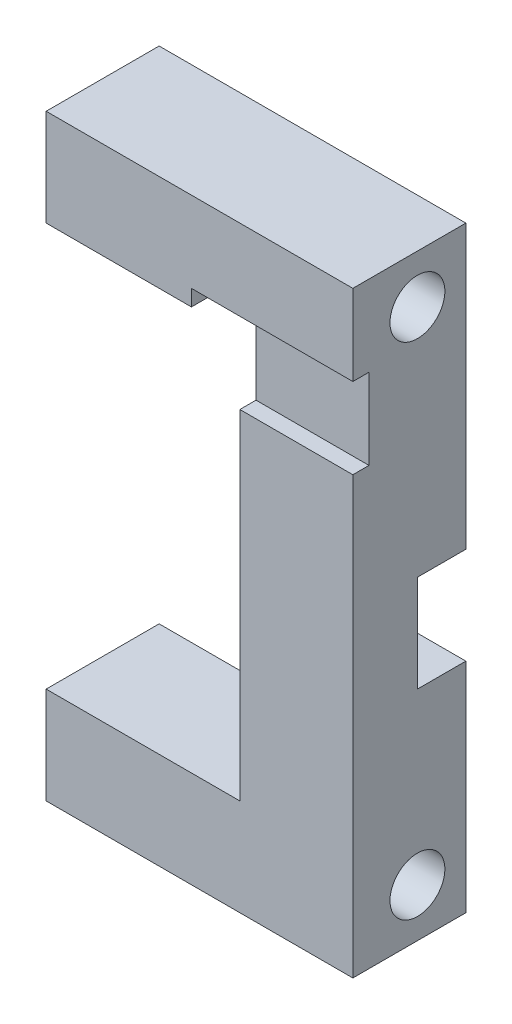
ISO-10303-21;
HEADER;
FILE_DESCRIPTION(('STEP AP214'),'2;1');
FILE_NAME('part.step','',(''),(''),'','','');
FILE_SCHEMA(('AUTOMOTIVE_DESIGN { 1 0 10303 214 1 1 1 1 }'));
ENDSEC;
DATA;
#1=APPLICATION_CONTEXT('core data for automotive mechanical design processes');
#2=APPLICATION_PROTOCOL_DEFINITION('international standard','automotive_design',2000,#1);
#3=PRODUCT_CONTEXT('',#1,'mechanical');
#4=PRODUCT('Part','Part','',(#3));
#5=PRODUCT_RELATED_PRODUCT_CATEGORY('part','',(#4));
#6=PRODUCT_DEFINITION_FORMATION('','',#4);
#7=PRODUCT_DEFINITION_CONTEXT('part definition',#1,'design');
#8=PRODUCT_DEFINITION('design','',#6,#7);
#9=PRODUCT_DEFINITION_SHAPE('','',#8);
#10=(LENGTH_UNIT() NAMED_UNIT(*) SI_UNIT(.MILLI.,.METRE.));
#11=(NAMED_UNIT(*) PLANE_ANGLE_UNIT() SI_UNIT($,.RADIAN.));
#12=(NAMED_UNIT(*) SI_UNIT($,.STERADIAN.) SOLID_ANGLE_UNIT());
#13=UNCERTAINTY_MEASURE_WITH_UNIT(LENGTH_MEASURE(1.E-05),#10,'distance_accuracy_value','');
#14=(GEOMETRIC_REPRESENTATION_CONTEXT(3) GLOBAL_UNCERTAINTY_ASSIGNED_CONTEXT((#13)) GLOBAL_UNIT_ASSIGNED_CONTEXT((#10,
#11,#12)) REPRESENTATION_CONTEXT('',''));
#15=CARTESIAN_POINT('',(0.,0.,0.));
#16=DIRECTION('',(0.,0.,1.));
#17=DIRECTION('',(1.,0.,0.));
#18=AXIS2_PLACEMENT_3D('',#15,#16,#17);
#19=CARTESIAN_POINT('',(0.,0.,7.));
#20=DIRECTION('',(0.,0.,-1.));
#21=DIRECTION('',(-1.,0.,0.));
#22=AXIS2_PLACEMENT_3D('',#19,#20,#21);
#23=PLANE('',#22);
#24=DIRECTION('',(1.,0.,0.));
#25=VECTOR('',#24,1.);
#26=CARTESIAN_POINT('',(12.,31.,7.));
#27=LINE('',#26,#25);
#28=CARTESIAN_POINT('',(0.,31.,7.));
#29=VERTEX_POINT('',#28);
#30=CARTESIAN_POINT('',(9.00000000000001,31.,7.));
#31=VERTEX_POINT('',#30);
#32=EDGE_CURVE('E274',#29,#31,#27,.T.);
#33=ORIENTED_EDGE('',*,*,#32,.T.);
#34=DIRECTION('',(0.,-1.,0.));
#35=VECTOR('',#34,1.);
#36=CARTESIAN_POINT('',(9.00000000000001,32.,7.));
#37=LINE('',#36,#35);
#38=CARTESIAN_POINT('',(9.00000000000001,32.,7.));
#39=VERTEX_POINT('',#38);
#40=EDGE_CURVE('E187',#39,#31,#37,.T.);
#41=ORIENTED_EDGE('',*,*,#40,.F.);
#42=DIRECTION('',(-1.,0.,0.));
#43=VECTOR('',#42,1.);
#44=CARTESIAN_POINT('',(9.00000000000001,32.,7.));
#45=LINE('',#44,#43);
#46=CARTESIAN_POINT('',(19.,32.,7.));
#47=VERTEX_POINT('',#46);
#48=EDGE_CURVE('E190',#47,#39,#45,.T.);
#49=ORIENTED_EDGE('',*,*,#48,.F.);
#50=DIRECTION('',(0.,1.,0.));
#51=VECTOR('',#50,1.);
#52=CARTESIAN_POINT('',(19.,37.,7.));
#53=LINE('',#52,#51);
#54=CARTESIAN_POINT('',(19.,37.,7.));
#55=VERTEX_POINT('',#54);
#56=EDGE_CURVE('E263',#47,#55,#53,.T.);
#57=ORIENTED_EDGE('',*,*,#56,.T.);
#58=DIRECTION('',(-1.,0.,0.));
#59=VECTOR('',#58,1.);
#60=CARTESIAN_POINT('',(0.,37.,7.));
#61=LINE('',#60,#59);
#62=CARTESIAN_POINT('',(0.,37.,7.));
#63=VERTEX_POINT('',#62);
#64=EDGE_CURVE('E268',#55,#63,#61,.T.);
#65=ORIENTED_EDGE('',*,*,#64,.T.);
#66=DIRECTION('',(0.,-1.,0.));
#67=VECTOR('',#66,1.);
#68=CARTESIAN_POINT('',(0.,31.,7.));
#69=LINE('',#68,#67);
#70=EDGE_CURVE('E271',#63,#29,#69,.T.);
#71=ORIENTED_EDGE('',*,*,#70,.T.);
#72=EDGE_LOOP('',(#33,#41,#49,#57,#65,#71));
#73=FACE_BOUND('',#72,.T.);
#74=ADVANCED_FACE('F39',(#73),#23,.F.);
#75=CARTESIAN_POINT('',(0.,0.,0.));
#76=DIRECTION('',(0.,0.,-1.));
#77=DIRECTION('',(-1.,0.,0.));
#78=AXIS2_PLACEMENT_3D('',#75,#76,#77);
#79=PLANE('',#78);
#80=DIRECTION('',(1.,0.,0.));
#81=VECTOR('',#80,1.);
#82=CARTESIAN_POINT('',(19.,19.5,0.));
#83=LINE('',#82,#81);
#84=CARTESIAN_POINT('',(12.,19.5,0.));
#85=VERTEX_POINT('',#84);
#86=CARTESIAN_POINT('',(19.,19.5,0.));
#87=VERTEX_POINT('',#86);
#88=EDGE_CURVE('E230',#85,#87,#83,.T.);
#89=ORIENTED_EDGE('',*,*,#88,.F.);
#90=DIRECTION('',(0.,-1.,0.));
#91=VECTOR('',#90,1.);
#92=CARTESIAN_POINT('',(12.,6.,0.));
#93=LINE('',#92,#91);
#94=CARTESIAN_POINT('',(12.,31.,0.));
#95=VERTEX_POINT('',#94);
#96=EDGE_CURVE('E307',#95,#85,#93,.T.);
#97=ORIENTED_EDGE('',*,*,#96,.F.);
#98=DIRECTION('',(1.,0.,0.));
#99=VECTOR('',#98,1.);
#100=CARTESIAN_POINT('',(12.,31.,0.));
#101=LINE('',#100,#99);
#102=CARTESIAN_POINT('',(0.,31.,0.));
#103=VERTEX_POINT('',#102);
#104=EDGE_CURVE('E302',#103,#95,#101,.T.);
#105=ORIENTED_EDGE('',*,*,#104,.F.);
#106=DIRECTION('',(0.,-1.,0.));
#107=VECTOR('',#106,1.);
#108=CARTESIAN_POINT('',(0.,31.,0.));
#109=LINE('',#108,#107);
#110=CARTESIAN_POINT('',(0.,37.,0.));
#111=VERTEX_POINT('',#110);
#112=EDGE_CURVE('E299',#111,#103,#109,.T.);
#113=ORIENTED_EDGE('',*,*,#112,.F.);
#114=DIRECTION('',(-1.,0.,0.));
#115=VECTOR('',#114,1.);
#116=CARTESIAN_POINT('',(0.,37.,0.));
#117=LINE('',#116,#115);
#118=CARTESIAN_POINT('',(19.,37.,0.));
#119=VERTEX_POINT('',#118);
#120=EDGE_CURVE('E296',#119,#111,#117,.T.);
#121=ORIENTED_EDGE('',*,*,#120,.F.);
#122=DIRECTION('',(0.,1.,0.));
#123=VECTOR('',#122,1.);
#124=CARTESIAN_POINT('',(19.,37.,0.));
#125=LINE('',#124,#123);
#126=EDGE_CURVE('E291',#87,#119,#125,.T.);
#127=ORIENTED_EDGE('',*,*,#126,.F.);
#128=EDGE_LOOP('',(#89,#97,#105,#113,#121,#127));
#129=FACE_BOUND('',#128,.T.);
#130=ADVANCED_FACE('F383',(#129),#79,.T.);
#131=CARTESIAN_POINT('',(19.,0.,7.));
#132=DIRECTION('',(0.,1.,0.));
#133=DIRECTION('',(-1.,0.,0.));
#134=AXIS2_PLACEMENT_3D('',#131,#132,#133);
#135=PLANE('',#134);
#136=DIRECTION('',(1.,0.,0.));
#137=VECTOR('',#136,1.);
#138=CARTESIAN_POINT('',(19.,0.,0.));
#139=LINE('',#138,#137);
#140=CARTESIAN_POINT('',(0.,0.,0.));
#141=VERTEX_POINT('',#140);
#142=CARTESIAN_POINT('',(19.,0.,0.));
#143=VERTEX_POINT('',#142);
#144=EDGE_CURVE('E249',#141,#143,#139,.T.);
#145=ORIENTED_EDGE('',*,*,#144,.T.);
#146=DIRECTION('',(0.,0.,-1.));
#147=VECTOR('',#146,1.);
#148=CARTESIAN_POINT('',(19.,0.,7.));
#149=LINE('',#148,#147);
#150=CARTESIAN_POINT('',(19.,0.,7.));
#151=VERTEX_POINT('',#150);
#152=EDGE_CURVE('E342',#151,#143,#149,.T.);
#153=ORIENTED_EDGE('',*,*,#152,.F.);
#154=DIRECTION('',(1.,0.,0.));
#155=VECTOR('',#154,1.);
#156=CARTESIAN_POINT('',(19.,0.,7.));
#157=LINE('',#156,#155);
#158=CARTESIAN_POINT('',(0.,0.,7.));
#159=VERTEX_POINT('',#158);
#160=EDGE_CURVE('E259',#159,#151,#157,.T.);
#161=ORIENTED_EDGE('',*,*,#160,.F.);
#162=DIRECTION('',(0.,0.,-1.));
#163=VECTOR('',#162,1.);
#164=CARTESIAN_POINT('',(0.,0.,7.));
#165=LINE('',#164,#163);
#166=EDGE_CURVE('E287',#159,#141,#165,.T.);
#167=ORIENTED_EDGE('',*,*,#166,.T.);
#168=EDGE_LOOP('',(#145,#153,#161,#167));
#169=FACE_BOUND('',#168,.T.);
#170=ADVANCED_FACE('F41',(#169),#135,.F.);
#171=CARTESIAN_POINT('',(19.,37.,7.));
#172=DIRECTION('',(-1.,0.,0.));
#173=DIRECTION('',(0.,-1.,0.));
#174=AXIS2_PLACEMENT_3D('',#171,#172,#173);
#175=PLANE('',#174);
#176=ORIENTED_EDGE('',*,*,#56,.F.);
#177=DIRECTION('',(0.,0.,1.));
#178=VECTOR('',#177,1.);
#179=CARTESIAN_POINT('',(19.,32.,6.));
#180=LINE('',#179,#178);
#181=CARTESIAN_POINT('',(19.,32.,6.));
#182=VERTEX_POINT('',#181);
#183=EDGE_CURVE('E174',#182,#47,#180,.T.);
#184=ORIENTED_EDGE('',*,*,#183,.F.);
#185=DIRECTION('',(0.,1.,0.));
#186=VECTOR('',#185,1.);
#187=CARTESIAN_POINT('',(19.,32.,6.));
#188=LINE('',#187,#186);
#189=CARTESIAN_POINT('',(19.,27.,6.));
#190=VERTEX_POINT('',#189);
#191=EDGE_CURVE('E162',#190,#182,#188,.T.);
#192=ORIENTED_EDGE('',*,*,#191,.F.);
#193=DIRECTION('',(0.,0.,1.));
#194=VECTOR('',#193,1.);
#195=CARTESIAN_POINT('',(19.,27.,6.));
#196=LINE('',#195,#194);
#197=CARTESIAN_POINT('',(19.,27.,7.));
#198=VERTEX_POINT('',#197);
#199=EDGE_CURVE('E169',#190,#198,#196,.T.);
#200=ORIENTED_EDGE('',*,*,#199,.T.);
#201=EDGE_CURVE('E265',#151,#198,#53,.T.);
#202=ORIENTED_EDGE('',*,*,#201,.F.);
#203=ORIENTED_EDGE('',*,*,#152,.T.);
#204=CARTESIAN_POINT('',(19.,13.5,0.));
#205=VERTEX_POINT('',#204);
#206=EDGE_CURVE('E292',#143,#205,#125,.T.);
#207=ORIENTED_EDGE('',*,*,#206,.T.);
#208=DIRECTION('',(0.,0.,-1.));
#209=VECTOR('',#208,1.);
#210=CARTESIAN_POINT('',(19.,13.5,3.));
#211=LINE('',#210,#209);
#212=CARTESIAN_POINT('',(19.,13.5,3.));
#213=VERTEX_POINT('',#212);
#214=EDGE_CURVE('E63',#213,#205,#211,.T.);
#215=ORIENTED_EDGE('',*,*,#214,.F.);
#216=DIRECTION('',(0.,-1.,0.));
#217=VECTOR('',#216,1.);
#218=CARTESIAN_POINT('',(19.,19.5,3.));
#219=LINE('',#218,#217);
#220=CARTESIAN_POINT('',(19.,19.5,3.));
#221=VERTEX_POINT('',#220);
#222=EDGE_CURVE('E225',#221,#213,#219,.T.);
#223=ORIENTED_EDGE('',*,*,#222,.F.);
#224=DIRECTION('',(0.,0.,-1.));
#225=VECTOR('',#224,1.);
#226=CARTESIAN_POINT('',(19.,19.5,3.));
#227=LINE('',#226,#225);
#228=EDGE_CURVE('E245',#221,#87,#227,.T.);
#229=ORIENTED_EDGE('',*,*,#228,.T.);
#230=ORIENTED_EDGE('',*,*,#126,.T.);
#231=DIRECTION('',(0.,0.,-1.));
#232=VECTOR('',#231,1.);
#233=CARTESIAN_POINT('',(19.,37.,7.));
#234=LINE('',#233,#232);
#235=EDGE_CURVE('E338',#55,#119,#234,.T.);
#236=ORIENTED_EDGE('',*,*,#235,.F.);
#237=EDGE_LOOP('',(#176,#184,#192,#200,#202,#203,#207,#215,#223,#229,#230,#236));
#238=FACE_BOUND('',#237,.T.);
#239=CARTESIAN_POINT('',(19.,34.,3.));
#240=DIRECTION('',(-1.,0.,0.));
#241=DIRECTION('',(0.,0.,1.));
#242=AXIS2_PLACEMENT_3D('',#239,#240,#241);
#243=CIRCLE('',#242,1.7);
#244=CARTESIAN_POINT('',(19.,34.,4.7));
#245=VERTEX_POINT('',#244);
#246=EDGE_CURVE('E209',#245,#245,#243,.T.);
#247=ORIENTED_EDGE('',*,*,#246,.T.);
#248=EDGE_LOOP('',(#247));
#249=FACE_BOUND('',#248,.T.);
#250=CARTESIAN_POINT('',(19.,3.,3.));
#251=DIRECTION('',(-1.,0.,0.));
#252=DIRECTION('',(0.,0.,1.));
#253=AXIS2_PLACEMENT_3D('',#250,#251,#252);
#254=CIRCLE('',#253,1.7);
#255=CARTESIAN_POINT('',(19.,3.,4.7));
#256=VERTEX_POINT('',#255);
#257=EDGE_CURVE('E218',#256,#256,#254,.T.);
#258=ORIENTED_EDGE('',*,*,#257,.T.);
#259=EDGE_LOOP('',(#258));
#260=FACE_BOUND('',#259,.T.);
#261=ADVANCED_FACE('F179',(#238,#249,#260),#175,.F.);
#262=CARTESIAN_POINT('',(0.,37.,7.));
#263=DIRECTION('',(0.,-1.,0.));
#264=DIRECTION('',(0.,0.,-1.));
#265=AXIS2_PLACEMENT_3D('',#262,#263,#264);
#266=PLANE('',#265);
#267=ORIENTED_EDGE('',*,*,#120,.T.);
#268=DIRECTION('',(0.,0.,-1.));
#269=VECTOR('',#268,1.);
#270=CARTESIAN_POINT('',(0.,37.,7.));
#271=LINE('',#270,#269);
#272=EDGE_CURVE('E334',#63,#111,#271,.T.);
#273=ORIENTED_EDGE('',*,*,#272,.F.);
#274=ORIENTED_EDGE('',*,*,#64,.F.);
#275=ORIENTED_EDGE('',*,*,#235,.T.);
#276=EDGE_LOOP('',(#267,#273,#274,#275));
#277=FACE_BOUND('',#276,.T.);
#278=ADVANCED_FACE('F395',(#277),#266,.F.);
#279=CARTESIAN_POINT('',(0.,31.,7.));
#280=DIRECTION('',(1.,0.,0.));
#281=DIRECTION('',(0.,0.,-1.));
#282=AXIS2_PLACEMENT_3D('',#279,#280,#281);
#283=PLANE('',#282);
#284=CARTESIAN_POINT('',(0.,34.,3.));
#285=DIRECTION('',(-1.,0.,0.));
#286=DIRECTION('',(0.,0.,1.));
#287=AXIS2_PLACEMENT_3D('',#284,#285,#286);
#288=CIRCLE('',#287,1.7);
#289=CARTESIAN_POINT('',(0.,34.,4.7));
#290=VERTEX_POINT('',#289);
#291=EDGE_CURVE('E214',#290,#290,#288,.T.);
#292=ORIENTED_EDGE('',*,*,#291,.F.);
#293=EDGE_LOOP('',(#292));
#294=FACE_BOUND('',#293,.T.);
#295=ORIENTED_EDGE('',*,*,#112,.T.);
#296=DIRECTION('',(0.,0.,-1.));
#297=VECTOR('',#296,1.);
#298=CARTESIAN_POINT('',(0.,31.,7.));
#299=LINE('',#298,#297);
#300=EDGE_CURVE('E330',#29,#103,#299,.T.);
#301=ORIENTED_EDGE('',*,*,#300,.F.);
#302=ORIENTED_EDGE('',*,*,#70,.F.);
#303=ORIENTED_EDGE('',*,*,#272,.T.);
#304=EDGE_LOOP('',(#295,#301,#302,#303));
#305=FACE_BOUND('',#304,.T.);
#306=ADVANCED_FACE('F399',(#294,#305),#283,.F.);
#307=CARTESIAN_POINT('',(12.,31.,7.));
#308=DIRECTION('',(0.,1.,0.));
#309=DIRECTION('',(0.,0.,1.));
#310=AXIS2_PLACEMENT_3D('',#307,#308,#309);
#311=PLANE('',#310);
#312=DIRECTION('',(1.,0.,0.));
#313=VECTOR('',#312,1.);
#314=CARTESIAN_POINT('',(12.,31.,6.));
#315=LINE('',#314,#313);
#316=CARTESIAN_POINT('',(9.00000000000001,31.,6.));
#317=VERTEX_POINT('',#316);
#318=CARTESIAN_POINT('',(12.,31.,6.));
#319=VERTEX_POINT('',#318);
#320=EDGE_CURVE('E205',#317,#319,#315,.T.);
#321=ORIENTED_EDGE('',*,*,#320,.F.);
#322=DIRECTION('',(0.,0.,1.));
#323=VECTOR('',#322,1.);
#324=CARTESIAN_POINT('',(9.00000000000001,31.,7.));
#325=LINE('',#324,#323);
#326=EDGE_CURVE('E201',#317,#31,#325,.T.);
#327=ORIENTED_EDGE('',*,*,#326,.T.);
#328=ORIENTED_EDGE('',*,*,#32,.F.);
#329=ORIENTED_EDGE('',*,*,#300,.T.);
#330=ORIENTED_EDGE('',*,*,#104,.T.);
#331=DIRECTION('',(0.,0.,-1.));
#332=VECTOR('',#331,1.);
#333=CARTESIAN_POINT('',(12.,31.,7.));
#334=LINE('',#333,#332);
#335=EDGE_CURVE('E327',#319,#95,#334,.T.);
#336=ORIENTED_EDGE('',*,*,#335,.F.);
#337=EDGE_LOOP('',(#321,#327,#328,#329,#330,#336));
#338=FACE_BOUND('',#337,.T.);
#339=ADVANCED_FACE('F403',(#338),#311,.F.);
#340=CARTESIAN_POINT('',(12.,6.,7.));
#341=DIRECTION('',(1.,0.,0.));
#342=DIRECTION('',(0.,1.,0.));
#343=AXIS2_PLACEMENT_3D('',#340,#341,#342);
#344=PLANE('',#343);
#345=DIRECTION('',(0.,-1.,0.));
#346=VECTOR('',#345,1.);
#347=CARTESIAN_POINT('',(12.,31.,7.));
#348=LINE('',#347,#346);
#349=CARTESIAN_POINT('',(12.,27.,7.));
#350=VERTEX_POINT('',#349);
#351=CARTESIAN_POINT('',(12.,6.,7.));
#352=VERTEX_POINT('',#351);
#353=EDGE_CURVE('E278',#350,#352,#348,.T.);
#354=ORIENTED_EDGE('',*,*,#353,.F.);
#355=DIRECTION('',(0.,0.,-1.));
#356=VECTOR('',#355,1.);
#357=CARTESIAN_POINT('',(12.,27.,7.));
#358=LINE('',#357,#356);
#359=CARTESIAN_POINT('',(12.,27.,6.));
#360=VERTEX_POINT('',#359);
#361=EDGE_CURVE('E55',#350,#360,#358,.T.);
#362=ORIENTED_EDGE('',*,*,#361,.T.);
#363=DIRECTION('',(0.,-1.,0.));
#364=VECTOR('',#363,1.);
#365=CARTESIAN_POINT('',(12.,6.,6.));
#366=LINE('',#365,#364);
#367=EDGE_CURVE('E11',#319,#360,#366,.T.);
#368=ORIENTED_EDGE('',*,*,#367,.F.);
#369=ORIENTED_EDGE('',*,*,#335,.T.);
#370=ORIENTED_EDGE('',*,*,#96,.T.);
#371=DIRECTION('',(0.,0.,-1.));
#372=VECTOR('',#371,1.);
#373=CARTESIAN_POINT('',(12.,19.5,3.));
#374=LINE('',#373,#372);
#375=CARTESIAN_POINT('',(12.,19.5,3.));
#376=VERTEX_POINT('',#375);
#377=EDGE_CURVE('E250',#376,#85,#374,.T.);
#378=ORIENTED_EDGE('',*,*,#377,.F.);
#379=DIRECTION('',(0.,1.,0.));
#380=VECTOR('',#379,1.);
#381=CARTESIAN_POINT('',(12.,19.5,3.));
#382=LINE('',#381,#380);
#383=CARTESIAN_POINT('',(12.,13.5,3.));
#384=VERTEX_POINT('',#383);
#385=EDGE_CURVE('E234',#384,#376,#382,.T.);
#386=ORIENTED_EDGE('',*,*,#385,.F.);
#387=DIRECTION('',(0.,0.,-1.));
#388=VECTOR('',#387,1.);
#389=CARTESIAN_POINT('',(12.,13.5,3.));
#390=LINE('',#389,#388);
#391=CARTESIAN_POINT('',(12.,13.5,0.));
#392=VERTEX_POINT('',#391);
#393=EDGE_CURVE('E253',#384,#392,#390,.T.);
#394=ORIENTED_EDGE('',*,*,#393,.T.);
#395=CARTESIAN_POINT('',(12.,6.,0.));
#396=VERTEX_POINT('',#395);
#397=EDGE_CURVE('E306',#392,#396,#93,.T.);
#398=ORIENTED_EDGE('',*,*,#397,.T.);
#399=DIRECTION('',(0.,0.,-1.));
#400=VECTOR('',#399,1.);
#401=CARTESIAN_POINT('',(12.,6.,7.));
#402=LINE('',#401,#400);
#403=EDGE_CURVE('E323',#352,#396,#402,.T.);
#404=ORIENTED_EDGE('',*,*,#403,.F.);
#405=EDGE_LOOP('',(#354,#362,#368,#369,#370,#378,#386,#394,#398,#404));
#406=FACE_BOUND('',#405,.T.);
#407=ADVANCED_FACE('F351',(#406),#344,.F.);
#408=CARTESIAN_POINT('',(0.,6.,7.));
#409=DIRECTION('',(0.,-1.,0.));
#410=DIRECTION('',(1.,0.,0.));
#411=AXIS2_PLACEMENT_3D('',#408,#409,#410);
#412=PLANE('',#411);
#413=DIRECTION('',(-1.,0.,0.));
#414=VECTOR('',#413,1.);
#415=CARTESIAN_POINT('',(0.,6.,0.));
#416=LINE('',#415,#414);
#417=CARTESIAN_POINT('',(0.,6.,0.));
#418=VERTEX_POINT('',#417);
#419=EDGE_CURVE('E311',#396,#418,#416,.T.);
#420=ORIENTED_EDGE('',*,*,#419,.T.);
#421=DIRECTION('',(0.,0.,-1.));
#422=VECTOR('',#421,1.);
#423=CARTESIAN_POINT('',(0.,6.,7.));
#424=LINE('',#423,#422);
#425=CARTESIAN_POINT('',(0.,6.,7.));
#426=VERTEX_POINT('',#425);
#427=EDGE_CURVE('E319',#426,#418,#424,.T.);
#428=ORIENTED_EDGE('',*,*,#427,.F.);
#429=DIRECTION('',(-1.,0.,0.));
#430=VECTOR('',#429,1.);
#431=CARTESIAN_POINT('',(0.,6.,7.));
#432=LINE('',#431,#430);
#433=EDGE_CURVE('E281',#352,#426,#432,.T.);
#434=ORIENTED_EDGE('',*,*,#433,.F.);
#435=ORIENTED_EDGE('',*,*,#403,.T.);
#436=EDGE_LOOP('',(#420,#428,#434,#435));
#437=FACE_BOUND('',#436,.T.);
#438=ADVANCED_FACE('F357',(#437),#412,.F.);
#439=CARTESIAN_POINT('',(0.,0.,7.));
#440=DIRECTION('',(1.,0.,0.));
#441=DIRECTION('',(0.,0.,-1.));
#442=AXIS2_PLACEMENT_3D('',#439,#440,#441);
#443=PLANE('',#442);
#444=CARTESIAN_POINT('',(0.,3.,3.));
#445=DIRECTION('',(-1.,0.,0.));
#446=DIRECTION('',(0.,0.,1.));
#447=AXIS2_PLACEMENT_3D('',#444,#445,#446);
#448=CIRCLE('',#447,1.7);
#449=CARTESIAN_POINT('',(0.,3.,4.7));
#450=VERTEX_POINT('',#449);
#451=EDGE_CURVE('E208',#450,#450,#448,.T.);
#452=ORIENTED_EDGE('',*,*,#451,.F.);
#453=EDGE_LOOP('',(#452));
#454=FACE_BOUND('',#453,.T.);
#455=DIRECTION('',(0.,-1.,0.));
#456=VECTOR('',#455,1.);
#457=CARTESIAN_POINT('',(0.,0.,0.));
#458=LINE('',#457,#456);
#459=EDGE_CURVE('E264',#418,#141,#458,.T.);
#460=ORIENTED_EDGE('',*,*,#459,.T.);
#461=ORIENTED_EDGE('',*,*,#166,.F.);
#462=DIRECTION('',(0.,-1.,0.));
#463=VECTOR('',#462,1.);
#464=CARTESIAN_POINT('',(0.,0.,7.));
#465=LINE('',#464,#463);
#466=EDGE_CURVE('E284',#426,#159,#465,.T.);
#467=ORIENTED_EDGE('',*,*,#466,.F.);
#468=ORIENTED_EDGE('',*,*,#427,.T.);
#469=EDGE_LOOP('',(#460,#461,#467,#468));
#470=FACE_BOUND('',#469,.T.);
#471=ADVANCED_FACE('F363',(#454,#470),#443,.F.);
#472=ORIENTED_EDGE('',*,*,#201,.T.);
#473=DIRECTION('',(-1.,0.,0.));
#474=VECTOR('',#473,1.);
#475=CARTESIAN_POINT('',(0.,27.,7.));
#476=LINE('',#475,#474);
#477=EDGE_CURVE('E48',#198,#350,#476,.T.);
#478=ORIENTED_EDGE('',*,*,#477,.T.);
#479=ORIENTED_EDGE('',*,*,#353,.T.);
#480=ORIENTED_EDGE('',*,*,#433,.T.);
#481=ORIENTED_EDGE('',*,*,#466,.T.);
#482=ORIENTED_EDGE('',*,*,#160,.T.);
#483=EDGE_LOOP('',(#472,#478,#479,#480,#481,#482));
#484=FACE_BOUND('',#483,.T.);
#485=ADVANCED_FACE('F348',(#484),#23,.F.);
#486=DIRECTION('',(-1.,0.,0.));
#487=VECTOR('',#486,1.);
#488=CARTESIAN_POINT('',(19.,13.5,0.));
#489=LINE('',#488,#487);
#490=EDGE_CURVE('E213',#205,#392,#489,.T.);
#491=ORIENTED_EDGE('',*,*,#490,.F.);
#492=ORIENTED_EDGE('',*,*,#206,.F.);
#493=ORIENTED_EDGE('',*,*,#144,.F.);
#494=ORIENTED_EDGE('',*,*,#459,.F.);
#495=ORIENTED_EDGE('',*,*,#419,.F.);
#496=ORIENTED_EDGE('',*,*,#397,.F.);
#497=EDGE_LOOP('',(#491,#492,#493,#494,#495,#496));
#498=FACE_BOUND('',#497,.T.);
#499=ADVANCED_FACE('F369',(#498),#79,.T.);
#500=CARTESIAN_POINT('',(19.,19.5,3.));
#501=DIRECTION('',(0.,1.,0.));
#502=DIRECTION('',(-1.,0.,0.));
#503=AXIS2_PLACEMENT_3D('',#500,#501,#502);
#504=PLANE('',#503);
#505=ORIENTED_EDGE('',*,*,#88,.T.);
#506=ORIENTED_EDGE('',*,*,#228,.F.);
#507=DIRECTION('',(1.,0.,0.));
#508=VECTOR('',#507,1.);
#509=CARTESIAN_POINT('',(19.,19.5,3.));
#510=LINE('',#509,#508);
#511=EDGE_CURVE('E237',#376,#221,#510,.T.);
#512=ORIENTED_EDGE('',*,*,#511,.F.);
#513=ORIENTED_EDGE('',*,*,#377,.T.);
#514=EDGE_LOOP('',(#505,#506,#512,#513));
#515=FACE_BOUND('',#514,.T.);
#516=ADVANCED_FACE('F377',(#515),#504,.F.);
#517=CARTESIAN_POINT('',(19.,13.5,3.));
#518=DIRECTION('',(0.,-1.,0.));
#519=DIRECTION('',(1.,0.,0.));
#520=AXIS2_PLACEMENT_3D('',#517,#518,#519);
#521=PLANE('',#520);
#522=ORIENTED_EDGE('',*,*,#490,.T.);
#523=ORIENTED_EDGE('',*,*,#393,.F.);
#524=DIRECTION('',(-1.,0.,0.));
#525=VECTOR('',#524,1.);
#526=CARTESIAN_POINT('',(19.,13.5,3.));
#527=LINE('',#526,#525);
#528=EDGE_CURVE('E229',#213,#384,#527,.T.);
#529=ORIENTED_EDGE('',*,*,#528,.F.);
#530=ORIENTED_EDGE('',*,*,#214,.T.);
#531=EDGE_LOOP('',(#522,#523,#529,#530));
#532=FACE_BOUND('',#531,.T.);
#533=ADVANCED_FACE('F370',(#532),#521,.F.);
#534=CARTESIAN_POINT('',(0.,0.,3.));
#535=DIRECTION('',(0.,0.,-1.));
#536=DIRECTION('',(-1.,0.,0.));
#537=AXIS2_PLACEMENT_3D('',#534,#535,#536);
#538=PLANE('',#537);
#539=ORIENTED_EDGE('',*,*,#222,.T.);
#540=ORIENTED_EDGE('',*,*,#528,.T.);
#541=ORIENTED_EDGE('',*,*,#385,.T.);
#542=ORIENTED_EDGE('',*,*,#511,.T.);
#543=EDGE_LOOP('',(#539,#540,#541,#542));
#544=FACE_BOUND('',#543,.T.);
#545=ADVANCED_FACE('F375',(#544),#538,.T.);
#546=CARTESIAN_POINT('',(19.,3.,3.));
#547=DIRECTION('',(-1.,0.,0.));
#548=DIRECTION('',(0.,0.,1.));
#549=AXIS2_PLACEMENT_3D('',#546,#547,#548);
#550=CYLINDRICAL_SURFACE('',#549,1.7);
#551=ORIENTED_EDGE('',*,*,#257,.F.);
#552=EDGE_LOOP('',(#551));
#553=FACE_BOUND('',#552,.T.);
#554=ORIENTED_EDGE('',*,*,#451,.T.);
#555=EDGE_LOOP('',(#554));
#556=FACE_BOUND('',#555,.T.);
#557=ADVANCED_FACE('F493',(#553,#556),#550,.F.);
#558=CARTESIAN_POINT('',(19.,34.,3.));
#559=DIRECTION('',(-1.,0.,0.));
#560=DIRECTION('',(0.,0.,1.));
#561=AXIS2_PLACEMENT_3D('',#558,#559,#560);
#562=CYLINDRICAL_SURFACE('',#561,1.7);
#563=ORIENTED_EDGE('',*,*,#246,.F.);
#564=EDGE_LOOP('',(#563));
#565=FACE_BOUND('',#564,.T.);
#566=ORIENTED_EDGE('',*,*,#291,.T.);
#567=EDGE_LOOP('',(#566));
#568=FACE_BOUND('',#567,.T.);
#569=ADVANCED_FACE('F514',(#565,#568),#562,.F.);
#570=CARTESIAN_POINT('',(0.,0.,6.));
#571=DIRECTION('',(0.,0.,1.));
#572=DIRECTION('',(1.,0.,0.));
#573=AXIS2_PLACEMENT_3D('',#570,#571,#572);
#574=PLANE('',#573);
#575=ORIENTED_EDGE('',*,*,#320,.T.);
#576=ORIENTED_EDGE('',*,*,#367,.T.);
#577=DIRECTION('',(1.,0.,0.));
#578=VECTOR('',#577,1.);
#579=CARTESIAN_POINT('',(9.00000000000001,27.,6.));
#580=LINE('',#579,#578);
#581=EDGE_CURVE('E157',#360,#190,#580,.T.);
#582=ORIENTED_EDGE('',*,*,#581,.T.);
#583=ORIENTED_EDGE('',*,*,#191,.T.);
#584=DIRECTION('',(-1.,0.,0.));
#585=VECTOR('',#584,1.);
#586=CARTESIAN_POINT('',(9.00000000000001,32.,6.));
#587=LINE('',#586,#585);
#588=CARTESIAN_POINT('',(9.00000000000001,32.,6.));
#589=VERTEX_POINT('',#588);
#590=EDGE_CURVE('E175',#182,#589,#587,.T.);
#591=ORIENTED_EDGE('',*,*,#590,.T.);
#592=DIRECTION('',(0.,-1.,0.));
#593=VECTOR('',#592,1.);
#594=CARTESIAN_POINT('',(9.00000000000001,32.,6.));
#595=LINE('',#594,#593);
#596=EDGE_CURVE('E166',#589,#317,#595,.T.);
#597=ORIENTED_EDGE('',*,*,#596,.T.);
#598=EDGE_LOOP('',(#575,#576,#582,#583,#591,#597));
#599=FACE_BOUND('',#598,.T.);
#600=ADVANCED_FACE('F159',(#599),#574,.T.);
#601=CARTESIAN_POINT('',(9.00000000000001,32.,6.));
#602=DIRECTION('',(-1.,0.,0.));
#603=DIRECTION('',(0.,-1.,0.));
#604=AXIS2_PLACEMENT_3D('',#601,#602,#603);
#605=PLANE('',#604);
#606=ORIENTED_EDGE('',*,*,#596,.F.);
#607=DIRECTION('',(0.,0.,1.));
#608=VECTOR('',#607,1.);
#609=CARTESIAN_POINT('',(9.00000000000001,32.,6.));
#610=LINE('',#609,#608);
#611=EDGE_CURVE('E194',#589,#39,#610,.T.);
#612=ORIENTED_EDGE('',*,*,#611,.T.);
#613=ORIENTED_EDGE('',*,*,#40,.T.);
#614=ORIENTED_EDGE('',*,*,#326,.F.);
#615=EDGE_LOOP('',(#606,#612,#613,#614));
#616=FACE_BOUND('',#615,.T.);
#617=ADVANCED_FACE('F409',(#616),#605,.F.);
#618=CARTESIAN_POINT('',(9.00000000000001,27.,6.));
#619=DIRECTION('',(0.,-1.,0.));
#620=DIRECTION('',(1.,0.,0.));
#621=AXIS2_PLACEMENT_3D('',#618,#619,#620);
#622=PLANE('',#621);
#623=ORIENTED_EDGE('',*,*,#477,.F.);
#624=ORIENTED_EDGE('',*,*,#199,.F.);
#625=ORIENTED_EDGE('',*,*,#581,.F.);
#626=ORIENTED_EDGE('',*,*,#361,.F.);
#627=EDGE_LOOP('',(#623,#624,#625,#626));
#628=FACE_BOUND('',#627,.T.);
#629=ADVANCED_FACE('F170',(#628),#622,.F.);
#630=CARTESIAN_POINT('',(9.00000000000001,32.,6.));
#631=DIRECTION('',(0.,1.,0.));
#632=DIRECTION('',(0.,0.,1.));
#633=AXIS2_PLACEMENT_3D('',#630,#631,#632);
#634=PLANE('',#633);
#635=ORIENTED_EDGE('',*,*,#48,.T.);
#636=ORIENTED_EDGE('',*,*,#611,.F.);
#637=ORIENTED_EDGE('',*,*,#590,.F.);
#638=ORIENTED_EDGE('',*,*,#183,.T.);
#639=EDGE_LOOP('',(#635,#636,#637,#638));
#640=FACE_BOUND('',#639,.T.);
#641=ADVANCED_FACE('F412',(#640),#634,.F.);
#642=CLOSED_SHELL('',(#74,#130,#170,#261,#278,#306,#339,#407,#438,#471,#485,#499,#516,#533,#545,
#557,#569,#600,#617,#629,#641));
#643=MANIFOLD_SOLID_BREP('B2',#642);
#644=ADVANCED_BREP_SHAPE_REPRESENTATION('',(#18,#643),#14);
#645=SHAPE_DEFINITION_REPRESENTATION(#9,#644);
ENDSEC;
END-ISO-10303-21;
